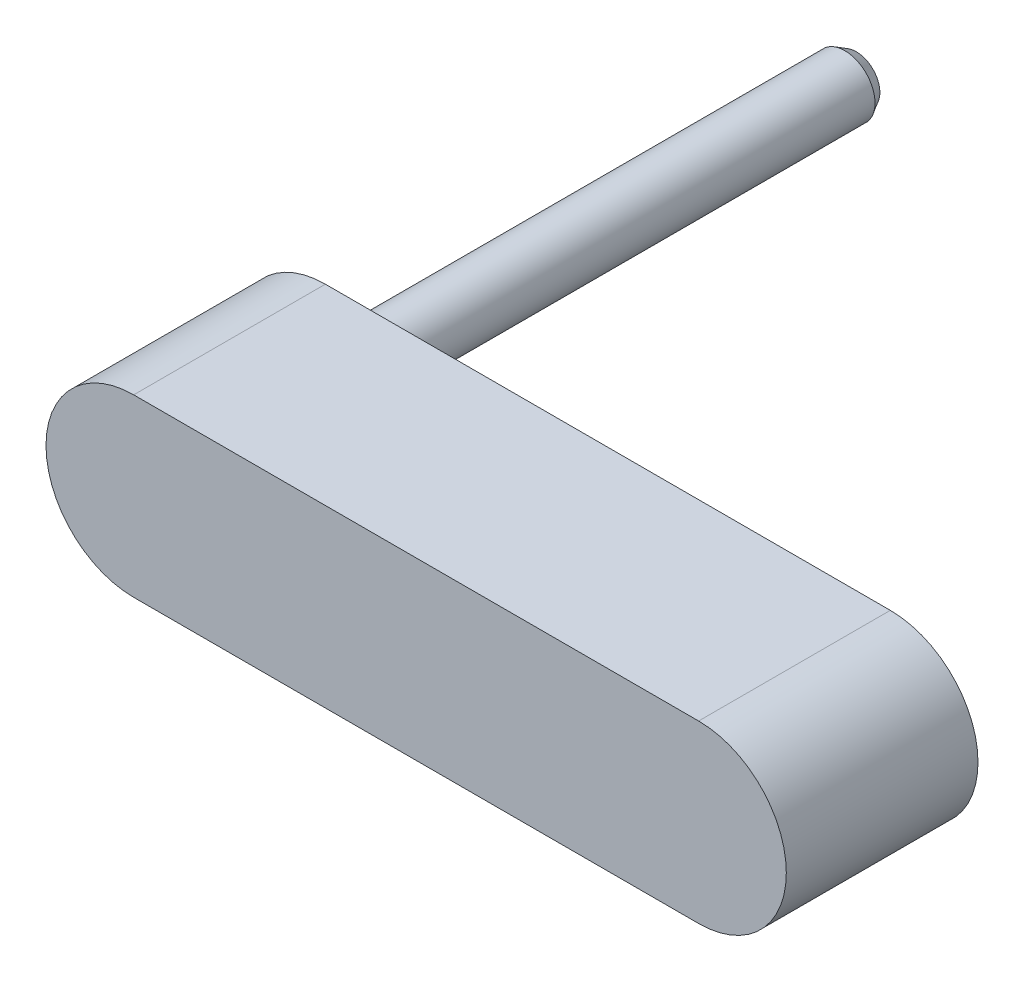
ISO-10303-21;
HEADER;
FILE_DESCRIPTION(('STEP AP214'),'2;1');
FILE_NAME('part.step','',(''),(''),'','','');
FILE_SCHEMA(('AUTOMOTIVE_DESIGN { 1 0 10303 214 1 1 1 1 }'));
ENDSEC;
DATA;
#1=APPLICATION_CONTEXT('core data for automotive mechanical design processes');
#2=APPLICATION_PROTOCOL_DEFINITION('international standard','automotive_design',2000,#1);
#3=PRODUCT_CONTEXT('',#1,'mechanical');
#4=PRODUCT('Part','Part','',(#3));
#5=PRODUCT_RELATED_PRODUCT_CATEGORY('part','',(#4));
#6=PRODUCT_DEFINITION_FORMATION('','',#4);
#7=PRODUCT_DEFINITION_CONTEXT('part definition',#1,'design');
#8=PRODUCT_DEFINITION('design','',#6,#7);
#9=PRODUCT_DEFINITION_SHAPE('','',#8);
#10=(LENGTH_UNIT() NAMED_UNIT(*) SI_UNIT(.MILLI.,.METRE.));
#11=(NAMED_UNIT(*) PLANE_ANGLE_UNIT() SI_UNIT($,.RADIAN.));
#12=(NAMED_UNIT(*) SI_UNIT($,.STERADIAN.) SOLID_ANGLE_UNIT());
#13=UNCERTAINTY_MEASURE_WITH_UNIT(LENGTH_MEASURE(1.E-05),#10,'distance_accuracy_value','');
#14=(GEOMETRIC_REPRESENTATION_CONTEXT(3) GLOBAL_UNCERTAINTY_ASSIGNED_CONTEXT((#13)) GLOBAL_UNIT_ASSIGNED_CONTEXT((#10,
#11,#12)) REPRESENTATION_CONTEXT('',''));
#15=CARTESIAN_POINT('',(0.,0.,0.));
#16=DIRECTION('',(0.,0.,1.));
#17=DIRECTION('',(1.,0.,0.));
#18=AXIS2_PLACEMENT_3D('',#15,#16,#17);
#19=CARTESIAN_POINT('',(0.,0.,20.));
#20=DIRECTION('',(0.,0.,-1.));
#21=DIRECTION('',(-1.,0.,0.));
#22=AXIS2_PLACEMENT_3D('',#19,#20,#21);
#23=CYLINDRICAL_SURFACE('',#22,9.15);
#24=CARTESIAN_POINT('',(0.,0.,0.));
#25=DIRECTION('',(0.,0.,1.));
#26=DIRECTION('',(1.,0.,0.));
#27=AXIS2_PLACEMENT_3D('',#24,#25,#26);
#28=CIRCLE('',#27,9.15);
#29=CARTESIAN_POINT('',(0.,9.15,0.));
#30=VERTEX_POINT('',#29);
#31=CARTESIAN_POINT('',(0.,-9.15,0.));
#32=VERTEX_POINT('',#31);
#33=EDGE_CURVE('E114',#30,#32,#28,.T.);
#34=ORIENTED_EDGE('',*,*,#33,.T.);
#35=DIRECTION('',(0.,0.,-1.));
#36=VECTOR('',#35,1.);
#37=CARTESIAN_POINT('',(0.,-9.15,20.));
#38=LINE('',#37,#36);
#39=CARTESIAN_POINT('',(0.,-9.15,20.));
#40=VERTEX_POINT('',#39);
#41=EDGE_CURVE('E103',#40,#32,#38,.T.);
#42=ORIENTED_EDGE('',*,*,#41,.F.);
#43=CARTESIAN_POINT('',(0.,0.,20.));
#44=DIRECTION('',(0.,0.,1.));
#45=DIRECTION('',(1.,0.,0.));
#46=AXIS2_PLACEMENT_3D('',#43,#44,#45);
#47=CIRCLE('',#46,9.15);
#48=CARTESIAN_POINT('',(0.,9.15,20.));
#49=VERTEX_POINT('',#48);
#50=EDGE_CURVE('E95',#49,#40,#47,.T.);
#51=ORIENTED_EDGE('',*,*,#50,.F.);
#52=DIRECTION('',(0.,0.,-1.));
#53=VECTOR('',#52,1.);
#54=CARTESIAN_POINT('',(0.,9.15,20.));
#55=LINE('',#54,#53);
#56=EDGE_CURVE('E110',#49,#30,#55,.T.);
#57=ORIENTED_EDGE('',*,*,#56,.T.);
#58=EDGE_LOOP('',(#34,#42,#51,#57));
#59=FACE_BOUND('',#58,.T.);
#60=ADVANCED_FACE('F41',(#59),#23,.T.);
#61=CARTESIAN_POINT('',(0.,-9.15,20.));
#62=DIRECTION('',(0.,1.,0.));
#63=DIRECTION('',(0.,0.,1.));
#64=AXIS2_PLACEMENT_3D('',#61,#62,#63);
#65=PLANE('',#64);
#66=DIRECTION('',(1.,0.,0.));
#67=VECTOR('',#66,1.);
#68=CARTESIAN_POINT('',(0.,-9.15,0.));
#69=LINE('',#68,#67);
#70=CARTESIAN_POINT('',(58.946,-9.15,0.));
#71=VERTEX_POINT('',#70);
#72=EDGE_CURVE('E101',#32,#71,#69,.T.);
#73=ORIENTED_EDGE('',*,*,#72,.T.);
#74=DIRECTION('',(0.,0.,-1.));
#75=VECTOR('',#74,1.);
#76=CARTESIAN_POINT('',(58.946,-9.15,20.));
#77=LINE('',#76,#75);
#78=CARTESIAN_POINT('',(58.946,-9.15,20.));
#79=VERTEX_POINT('',#78);
#80=EDGE_CURVE('E99',#79,#71,#77,.T.);
#81=ORIENTED_EDGE('',*,*,#80,.F.);
#82=DIRECTION('',(1.,0.,0.));
#83=VECTOR('',#82,1.);
#84=CARTESIAN_POINT('',(0.,-9.15,20.));
#85=LINE('',#84,#83);
#86=EDGE_CURVE('E90',#40,#79,#85,.T.);
#87=ORIENTED_EDGE('',*,*,#86,.F.);
#88=ORIENTED_EDGE('',*,*,#41,.T.);
#89=EDGE_LOOP('',(#73,#81,#87,#88));
#90=FACE_BOUND('',#89,.T.);
#91=ADVANCED_FACE('F100',(#90),#65,.F.);
#92=CARTESIAN_POINT('',(58.946,0.,20.));
#93=DIRECTION('',(0.,0.,-1.));
#94=DIRECTION('',(-1.,0.,0.));
#95=AXIS2_PLACEMENT_3D('',#92,#93,#94);
#96=CYLINDRICAL_SURFACE('',#95,9.15);
#97=CARTESIAN_POINT('',(58.946,0.,0.));
#98=DIRECTION('',(0.,0.,1.));
#99=DIRECTION('',(1.,0.,0.));
#100=AXIS2_PLACEMENT_3D('',#97,#98,#99);
#101=CIRCLE('',#100,9.15);
#102=CARTESIAN_POINT('',(58.946,9.15,0.));
#103=VERTEX_POINT('',#102);
#104=EDGE_CURVE('E76',#71,#103,#101,.T.);
#105=ORIENTED_EDGE('',*,*,#104,.T.);
#106=DIRECTION('',(0.,0.,-1.));
#107=VECTOR('',#106,1.);
#108=CARTESIAN_POINT('',(58.946,9.15,20.));
#109=LINE('',#108,#107);
#110=CARTESIAN_POINT('',(58.946,9.15,20.));
#111=VERTEX_POINT('',#110);
#112=EDGE_CURVE('E104',#111,#103,#109,.T.);
#113=ORIENTED_EDGE('',*,*,#112,.F.);
#114=CARTESIAN_POINT('',(58.946,0.,20.));
#115=DIRECTION('',(0.,0.,1.));
#116=DIRECTION('',(1.,0.,0.));
#117=AXIS2_PLACEMENT_3D('',#114,#115,#116);
#118=CIRCLE('',#117,9.15);
#119=EDGE_CURVE('E93',#79,#111,#118,.T.);
#120=ORIENTED_EDGE('',*,*,#119,.F.);
#121=ORIENTED_EDGE('',*,*,#80,.T.);
#122=EDGE_LOOP('',(#105,#113,#120,#121));
#123=FACE_BOUND('',#122,.T.);
#124=ADVANCED_FACE('F106',(#123),#96,.T.);
#125=CARTESIAN_POINT('',(0.,9.15,20.));
#126=DIRECTION('',(0.,-1.,0.));
#127=DIRECTION('',(0.,0.,-1.));
#128=AXIS2_PLACEMENT_3D('',#125,#126,#127);
#129=PLANE('',#128);
#130=DIRECTION('',(-1.,0.,0.));
#131=VECTOR('',#130,1.);
#132=CARTESIAN_POINT('',(0.,9.15,0.));
#133=LINE('',#132,#131);
#134=EDGE_CURVE('E82',#103,#30,#133,.T.);
#135=ORIENTED_EDGE('',*,*,#134,.T.);
#136=ORIENTED_EDGE('',*,*,#56,.F.);
#137=DIRECTION('',(-1.,0.,0.));
#138=VECTOR('',#137,1.);
#139=CARTESIAN_POINT('',(0.,9.15,20.));
#140=LINE('',#139,#138);
#141=EDGE_CURVE('E59',#111,#49,#140,.T.);
#142=ORIENTED_EDGE('',*,*,#141,.F.);
#143=ORIENTED_EDGE('',*,*,#112,.T.);
#144=EDGE_LOOP('',(#135,#136,#142,#143));
#145=FACE_BOUND('',#144,.T.);
#146=ADVANCED_FACE('F159',(#145),#129,.F.);
#147=CARTESIAN_POINT('',(0.,0.,0.));
#148=DIRECTION('',(0.,0.,1.));
#149=DIRECTION('',(1.,0.,0.));
#150=AXIS2_PLACEMENT_3D('',#147,#148,#149);
#151=PLANE('',#150);
#152=CARTESIAN_POINT('',(0.,0.,0.));
#153=DIRECTION('',(0.,0.,1.));
#154=DIRECTION('',(1.,0.,0.));
#155=AXIS2_PLACEMENT_3D('',#152,#153,#154);
#156=CIRCLE('',#155,3.15);
#157=CARTESIAN_POINT('',(3.15,0.,0.));
#158=VERTEX_POINT('',#157);
#159=EDGE_CURVE('E130',#158,#158,#156,.F.);
#160=ORIENTED_EDGE('',*,*,#159,.F.);
#161=EDGE_LOOP('',(#160));
#162=FACE_BOUND('',#161,.T.);
#163=ORIENTED_EDGE('',*,*,#33,.F.);
#164=ORIENTED_EDGE('',*,*,#134,.F.);
#165=ORIENTED_EDGE('',*,*,#104,.F.);
#166=ORIENTED_EDGE('',*,*,#72,.F.);
#167=EDGE_LOOP('',(#163,#164,#165,#166));
#168=FACE_BOUND('',#167,.T.);
#169=ADVANCED_FACE('F157',(#162,#168),#151,.F.);
#170=CARTESIAN_POINT('',(0.,0.,20.));
#171=DIRECTION('',(0.,0.,1.));
#172=DIRECTION('',(1.,0.,0.));
#173=AXIS2_PLACEMENT_3D('',#170,#171,#172);
#174=PLANE('',#173);
#175=ORIENTED_EDGE('',*,*,#50,.T.);
#176=ORIENTED_EDGE('',*,*,#86,.T.);
#177=ORIENTED_EDGE('',*,*,#119,.T.);
#178=ORIENTED_EDGE('',*,*,#141,.T.);
#179=EDGE_LOOP('',(#175,#176,#177,#178));
#180=FACE_BOUND('',#179,.T.);
#181=ADVANCED_FACE('F91',(#180),#174,.T.);
#182=CARTESIAN_POINT('',(0.,0.,-55.4));
#183=DIRECTION('',(0.,0.,1.));
#184=DIRECTION('',(1.,0.,0.));
#185=AXIS2_PLACEMENT_3D('',#182,#183,#184);
#186=CYLINDRICAL_SURFACE('',#185,3.15);
#187=CARTESIAN_POINT('',(0.,0.,-54.2));
#188=DIRECTION('',(0.,0.,-1.));
#189=DIRECTION('',(-1.,0.,0.));
#190=AXIS2_PLACEMENT_3D('',#187,#188,#189);
#191=CIRCLE('',#190,3.15);
#192=CARTESIAN_POINT('',(-3.15,0.,-54.2));
#193=VERTEX_POINT('',#192);
#194=EDGE_CURVE('E11',#193,#193,#191,.F.);
#195=ORIENTED_EDGE('',*,*,#194,.T.);
#196=EDGE_LOOP('',(#195));
#197=FACE_BOUND('',#196,.T.);
#198=ORIENTED_EDGE('',*,*,#159,.T.);
#199=EDGE_LOOP('',(#198));
#200=FACE_BOUND('',#199,.T.);
#201=ADVANCED_FACE('F144',(#197,#200),#186,.T.);
#202=CARTESIAN_POINT('',(0.,0.,-55.4));
#203=DIRECTION('',(0.,0.,-1.));
#204=DIRECTION('',(-1.,0.,0.));
#205=AXIS2_PLACEMENT_3D('',#202,#203,#204);
#206=PLANE('',#205);
#207=CARTESIAN_POINT('',(0.,0.,-55.4));
#208=DIRECTION('',(0.,0.,-1.));
#209=DIRECTION('',(-1.,0.,0.));
#210=AXIS2_PLACEMENT_3D('',#207,#208,#209);
#211=CIRCLE('',#210,2.45717967697245);
#212=CARTESIAN_POINT('',(-2.45717967697245,0.,-55.4));
#213=VERTEX_POINT('',#212);
#214=EDGE_CURVE('E51',#213,#213,#211,.T.);
#215=ORIENTED_EDGE('',*,*,#214,.T.);
#216=EDGE_LOOP('',(#215));
#217=FACE_BOUND('',#216,.T.);
#218=ADVANCED_FACE('F137',(#217),#206,.T.);
#219=CARTESIAN_POINT('',(0.,0.,-55.4));
#220=DIRECTION('',(0.,0.,1.));
#221=DIRECTION('',(1.,0.,0.));
#222=AXIS2_PLACEMENT_3D('',#219,#220,#221);
#223=CONICAL_SURFACE('',#222,2.45717967697245,0.523598775598299);
#224=ORIENTED_EDGE('',*,*,#194,.F.);
#225=EDGE_LOOP('',(#224));
#226=FACE_BOUND('',#225,.T.);
#227=ORIENTED_EDGE('',*,*,#214,.F.);
#228=EDGE_LOOP('',(#227));
#229=FACE_BOUND('',#228,.T.);
#230=ADVANCED_FACE('F43',(#226,#229),#223,.T.);
#231=CLOSED_SHELL('',(#60,#91,#124,#146,#169,#181,#201,#218,#230));
#232=MANIFOLD_SOLID_BREP('B2',#231);
#233=ADVANCED_BREP_SHAPE_REPRESENTATION('',(#18,#232),#14);
#234=SHAPE_DEFINITION_REPRESENTATION(#9,#233);
ENDSEC;
END-ISO-10303-21;
